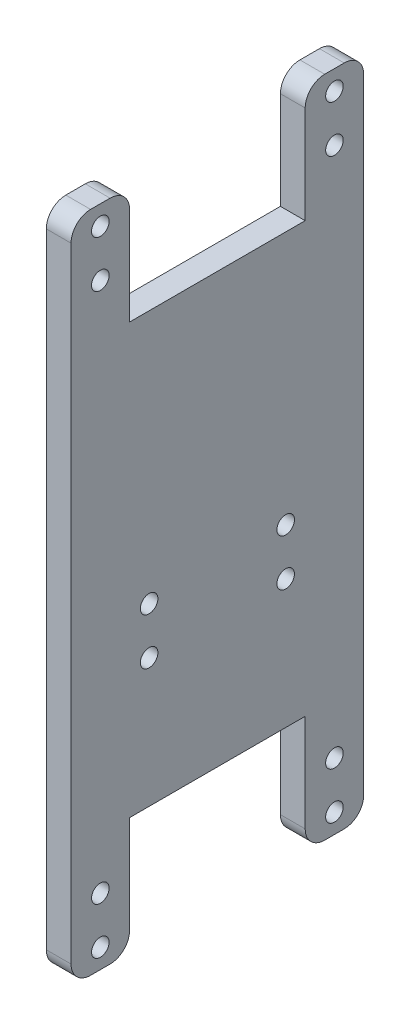
ISO-10303-21;
HEADER;
FILE_DESCRIPTION(('STEP AP214'),'2;1');
FILE_NAME('part.step','',(''),(''),'','','');
FILE_SCHEMA(('AUTOMOTIVE_DESIGN { 1 0 10303 214 1 1 1 1 }'));
ENDSEC;
DATA;
#1=APPLICATION_CONTEXT('core data for automotive mechanical design processes');
#2=APPLICATION_PROTOCOL_DEFINITION('international standard','automotive_design',2000,#1);
#3=PRODUCT_CONTEXT('',#1,'mechanical');
#4=PRODUCT('Part','Part','',(#3));
#5=PRODUCT_RELATED_PRODUCT_CATEGORY('part','',(#4));
#6=PRODUCT_DEFINITION_FORMATION('','',#4);
#7=PRODUCT_DEFINITION_CONTEXT('part definition',#1,'design');
#8=PRODUCT_DEFINITION('design','',#6,#7);
#9=PRODUCT_DEFINITION_SHAPE('','',#8);
#10=(LENGTH_UNIT() NAMED_UNIT(*) SI_UNIT(.MILLI.,.METRE.));
#11=(NAMED_UNIT(*) PLANE_ANGLE_UNIT() SI_UNIT($,.RADIAN.));
#12=(NAMED_UNIT(*) SI_UNIT($,.STERADIAN.) SOLID_ANGLE_UNIT());
#13=UNCERTAINTY_MEASURE_WITH_UNIT(LENGTH_MEASURE(1.E-05),#10,'distance_accuracy_value','');
#14=(GEOMETRIC_REPRESENTATION_CONTEXT(3) GLOBAL_UNCERTAINTY_ASSIGNED_CONTEXT((#13)) GLOBAL_UNIT_ASSIGNED_CONTEXT((#10,
#11,#12)) REPRESENTATION_CONTEXT('',''));
#15=CARTESIAN_POINT('',(0.,0.,0.));
#16=DIRECTION('',(0.,0.,1.));
#17=DIRECTION('',(1.,0.,0.));
#18=AXIS2_PLACEMENT_3D('',#15,#16,#17);
#19=CARTESIAN_POINT('',(6.35,0.,0.));
#20=DIRECTION('',(-1.,0.,0.));
#21=DIRECTION('',(0.,0.,1.));
#22=AXIS2_PLACEMENT_3D('',#19,#20,#21);
#23=PLANE('',#22);
#24=CARTESIAN_POINT('',(6.35,67.9999999999999,29.9999999999998));
#25=DIRECTION('',(-1.,0.,0.));
#26=DIRECTION('',(0.,0.,1.));
#27=AXIS2_PLACEMENT_3D('',#24,#25,#26);
#28=CIRCLE('',#27,2.25);
#29=CARTESIAN_POINT('',(6.35,67.9999999999999,32.2499999999998));
#30=VERTEX_POINT('',#29);
#31=EDGE_CURVE('E386',#30,#30,#28,.T.);
#32=ORIENTED_EDGE('',*,*,#31,.T.);
#33=EDGE_LOOP('',(#32));
#34=FACE_BOUND('',#33,.T.);
#35=CARTESIAN_POINT('',(6.35,80.,29.9999999999998));
#36=DIRECTION('',(-1.,0.,0.));
#37=DIRECTION('',(0.,0.,1.));
#38=AXIS2_PLACEMENT_3D('',#35,#36,#37);
#39=CIRCLE('',#38,2.25);
#40=CARTESIAN_POINT('',(6.35,80.,32.2499999999998));
#41=VERTEX_POINT('',#40);
#42=EDGE_CURVE('E380',#41,#41,#39,.T.);
#43=ORIENTED_EDGE('',*,*,#42,.T.);
#44=EDGE_LOOP('',(#43));
#45=FACE_BOUND('',#44,.T.);
#46=CARTESIAN_POINT('',(6.35,67.9999999999999,-29.9999999999998));
#47=DIRECTION('',(-1.,0.,0.));
#48=DIRECTION('',(0.,0.,1.));
#49=AXIS2_PLACEMENT_3D('',#46,#47,#48);
#50=CIRCLE('',#49,2.25);
#51=CARTESIAN_POINT('',(6.35,67.9999999999999,-27.7499999999998));
#52=VERTEX_POINT('',#51);
#53=EDGE_CURVE('E374',#52,#52,#50,.T.);
#54=ORIENTED_EDGE('',*,*,#53,.T.);
#55=EDGE_LOOP('',(#54));
#56=FACE_BOUND('',#55,.T.);
#57=CARTESIAN_POINT('',(6.35,80.,-29.9999999999998));
#58=DIRECTION('',(-1.,0.,0.));
#59=DIRECTION('',(0.,0.,1.));
#60=AXIS2_PLACEMENT_3D('',#57,#58,#59);
#61=CIRCLE('',#60,2.25);
#62=CARTESIAN_POINT('',(6.35,80.,-27.7499999999998));
#63=VERTEX_POINT('',#62);
#64=EDGE_CURVE('E368',#63,#63,#61,.T.);
#65=ORIENTED_EDGE('',*,*,#64,.T.);
#66=EDGE_LOOP('',(#65));
#67=FACE_BOUND('',#66,.T.);
#68=CARTESIAN_POINT('',(6.35,-80.,29.9999999999997));
#69=DIRECTION('',(-1.,0.,0.));
#70=DIRECTION('',(0.,0.,1.));
#71=AXIS2_PLACEMENT_3D('',#68,#69,#70);
#72=CIRCLE('',#71,2.25);
#73=CARTESIAN_POINT('',(6.35,-80.,32.2499999999997));
#74=VERTEX_POINT('',#73);
#75=EDGE_CURVE('E362',#74,#74,#72,.T.);
#76=ORIENTED_EDGE('',*,*,#75,.T.);
#77=EDGE_LOOP('',(#76));
#78=FACE_BOUND('',#77,.T.);
#79=CARTESIAN_POINT('',(6.35,-67.9999999999999,29.9999999999997));
#80=DIRECTION('',(-1.,0.,0.));
#81=DIRECTION('',(0.,0.,1.));
#82=AXIS2_PLACEMENT_3D('',#79,#80,#81);
#83=CIRCLE('',#82,2.25);
#84=CARTESIAN_POINT('',(6.35,-67.9999999999999,32.2499999999997));
#85=VERTEX_POINT('',#84);
#86=EDGE_CURVE('E356',#85,#85,#83,.T.);
#87=ORIENTED_EDGE('',*,*,#86,.T.);
#88=EDGE_LOOP('',(#87));
#89=FACE_BOUND('',#88,.T.);
#90=CARTESIAN_POINT('',(6.35,-80.,-29.9999999999997));
#91=DIRECTION('',(-1.,0.,0.));
#92=DIRECTION('',(0.,0.,1.));
#93=AXIS2_PLACEMENT_3D('',#90,#91,#92);
#94=CIRCLE('',#93,2.25);
#95=CARTESIAN_POINT('',(6.35,-80.,-27.7499999999997));
#96=VERTEX_POINT('',#95);
#97=EDGE_CURVE('E350',#96,#96,#94,.T.);
#98=ORIENTED_EDGE('',*,*,#97,.T.);
#99=EDGE_LOOP('',(#98));
#100=FACE_BOUND('',#99,.T.);
#101=CARTESIAN_POINT('',(6.35,-68.,-29.9999999999997));
#102=DIRECTION('',(-1.,0.,0.));
#103=DIRECTION('',(0.,0.,1.));
#104=AXIS2_PLACEMENT_3D('',#101,#102,#103);
#105=CIRCLE('',#104,2.25);
#106=CARTESIAN_POINT('',(6.35,-68.,-27.7499999999997));
#107=VERTEX_POINT('',#106);
#108=EDGE_CURVE('E222',#107,#107,#105,.T.);
#109=ORIENTED_EDGE('',*,*,#108,.T.);
#110=EDGE_LOOP('',(#109));
#111=FACE_BOUND('',#110,.T.);
#112=DIRECTION('',(0.,-1.,0.));
#113=VECTOR('',#112,1.);
#114=CARTESIAN_POINT('',(6.35,-55.,-22.5));
#115=LINE('',#114,#113);
#116=CARTESIAN_POINT('',(6.35,-55.,-22.5));
#117=VERTEX_POINT('',#116);
#118=CARTESIAN_POINT('',(6.35,-80.,-22.5));
#119=VERTEX_POINT('',#118);
#120=EDGE_CURVE('E198',#117,#119,#115,.T.);
#121=ORIENTED_EDGE('',*,*,#120,.T.);
#122=CARTESIAN_POINT('',(6.35,-80.,-27.5));
#123=DIRECTION('',(-1.,0.,0.));
#124=DIRECTION('',(0.,0.,1.));
#125=AXIS2_PLACEMENT_3D('',#122,#123,#124);
#126=CIRCLE('',#125,5.);
#127=CARTESIAN_POINT('',(6.35,-85.,-27.5));
#128=VERTEX_POINT('',#127);
#129=EDGE_CURVE('E290',#119,#128,#126,.F.);
#130=ORIENTED_EDGE('',*,*,#129,.T.);
#131=DIRECTION('',(0.,0.,-1.));
#132=VECTOR('',#131,1.);
#133=CARTESIAN_POINT('',(6.35,-85.,-22.5));
#134=LINE('',#133,#132);
#135=CARTESIAN_POINT('',(6.35,-85.,-32.5));
#136=VERTEX_POINT('',#135);
#137=EDGE_CURVE('E200',#128,#136,#134,.T.);
#138=ORIENTED_EDGE('',*,*,#137,.T.);
#139=CARTESIAN_POINT('',(6.35,-80.,-32.5));
#140=DIRECTION('',(-1.,0.,0.));
#141=DIRECTION('',(0.,0.,1.));
#142=AXIS2_PLACEMENT_3D('',#139,#140,#141);
#143=CIRCLE('',#142,5.);
#144=CARTESIAN_POINT('',(6.35,-80.,-37.5));
#145=VERTEX_POINT('',#144);
#146=EDGE_CURVE('E284',#136,#145,#143,.F.);
#147=ORIENTED_EDGE('',*,*,#146,.T.);
#148=DIRECTION('',(0.,1.,0.));
#149=VECTOR('',#148,1.);
#150=CARTESIAN_POINT('',(6.35,-35.,-37.5));
#151=LINE('',#150,#149);
#152=CARTESIAN_POINT('',(6.35,80.,-37.5));
#153=VERTEX_POINT('',#152);
#154=EDGE_CURVE('E206',#145,#153,#151,.T.);
#155=ORIENTED_EDGE('',*,*,#154,.T.);
#156=CARTESIAN_POINT('',(6.35,80.,-32.5));
#157=DIRECTION('',(-1.,0.,0.));
#158=DIRECTION('',(0.,0.,1.));
#159=AXIS2_PLACEMENT_3D('',#156,#157,#158);
#160=CIRCLE('',#159,5.);
#161=CARTESIAN_POINT('',(6.35,85.,-32.5));
#162=VERTEX_POINT('',#161);
#163=EDGE_CURVE('E280',#153,#162,#160,.F.);
#164=ORIENTED_EDGE('',*,*,#163,.T.);
#165=DIRECTION('',(0.,0.,1.));
#166=VECTOR('',#165,1.);
#167=CARTESIAN_POINT('',(6.35,85.,-22.5));
#168=LINE('',#167,#166);
#169=CARTESIAN_POINT('',(6.35,85.,-27.5));
#170=VERTEX_POINT('',#169);
#171=EDGE_CURVE('E209',#162,#170,#168,.T.);
#172=ORIENTED_EDGE('',*,*,#171,.T.);
#173=CARTESIAN_POINT('',(6.35,80.,-27.5));
#174=DIRECTION('',(-1.,0.,0.));
#175=DIRECTION('',(0.,0.,1.));
#176=AXIS2_PLACEMENT_3D('',#173,#174,#175);
#177=CIRCLE('',#176,5.);
#178=CARTESIAN_POINT('',(6.35,80.,-22.5));
#179=VERTEX_POINT('',#178);
#180=EDGE_CURVE('E56',#170,#179,#177,.F.);
#181=ORIENTED_EDGE('',*,*,#180,.T.);
#182=DIRECTION('',(0.,-1.,0.));
#183=VECTOR('',#182,1.);
#184=CARTESIAN_POINT('',(6.35,55.,-22.5));
#185=LINE('',#184,#183);
#186=CARTESIAN_POINT('',(6.35,55.,-22.5));
#187=VERTEX_POINT('',#186);
#188=EDGE_CURVE('E211',#179,#187,#185,.T.);
#189=ORIENTED_EDGE('',*,*,#188,.T.);
#190=DIRECTION('',(0.,0.,1.));
#191=VECTOR('',#190,1.);
#192=CARTESIAN_POINT('',(6.35,55.,22.5));
#193=LINE('',#192,#191);
#194=CARTESIAN_POINT('',(6.35,55.,22.5));
#195=VERTEX_POINT('',#194);
#196=EDGE_CURVE('E213',#187,#195,#193,.T.);
#197=ORIENTED_EDGE('',*,*,#196,.T.);
#198=DIRECTION('',(0.,1.,0.));
#199=VECTOR('',#198,1.);
#200=CARTESIAN_POINT('',(6.35,85.,22.5));
#201=LINE('',#200,#199);
#202=CARTESIAN_POINT('',(6.35,80.,22.5));
#203=VERTEX_POINT('',#202);
#204=EDGE_CURVE('E215',#195,#203,#201,.T.);
#205=ORIENTED_EDGE('',*,*,#204,.T.);
#206=CARTESIAN_POINT('',(6.35,80.,27.5));
#207=DIRECTION('',(-1.,0.,0.));
#208=DIRECTION('',(0.,0.,1.));
#209=AXIS2_PLACEMENT_3D('',#206,#207,#208);
#210=CIRCLE('',#209,5.);
#211=CARTESIAN_POINT('',(6.35,85.,27.5));
#212=VERTEX_POINT('',#211);
#213=EDGE_CURVE('E286',#203,#212,#210,.F.);
#214=ORIENTED_EDGE('',*,*,#213,.T.);
#215=DIRECTION('',(0.,0.,1.));
#216=VECTOR('',#215,1.);
#217=CARTESIAN_POINT('',(6.35,85.,37.5));
#218=LINE('',#217,#216);
#219=CARTESIAN_POINT('',(6.35,85.,32.5));
#220=VERTEX_POINT('',#219);
#221=EDGE_CURVE('E249',#212,#220,#218,.T.);
#222=ORIENTED_EDGE('',*,*,#221,.T.);
#223=CARTESIAN_POINT('',(6.35,80.,32.5));
#224=DIRECTION('',(-1.,0.,0.));
#225=DIRECTION('',(0.,0.,1.));
#226=AXIS2_PLACEMENT_3D('',#223,#224,#225);
#227=CIRCLE('',#226,5.);
#228=CARTESIAN_POINT('',(6.35,80.,37.5));
#229=VERTEX_POINT('',#228);
#230=EDGE_CURVE('E278',#220,#229,#227,.F.);
#231=ORIENTED_EDGE('',*,*,#230,.T.);
#232=DIRECTION('',(0.,-1.,0.));
#233=VECTOR('',#232,1.);
#234=CARTESIAN_POINT('',(6.35,85.,37.5));
#235=LINE('',#234,#233);
#236=CARTESIAN_POINT('',(6.35,-80.,37.5));
#237=VERTEX_POINT('',#236);
#238=EDGE_CURVE('E325',#229,#237,#235,.T.);
#239=ORIENTED_EDGE('',*,*,#238,.T.);
#240=CARTESIAN_POINT('',(6.35,-80.,32.5));
#241=DIRECTION('',(-1.,0.,0.));
#242=DIRECTION('',(0.,0.,1.));
#243=AXIS2_PLACEMENT_3D('',#240,#241,#242);
#244=CIRCLE('',#243,5.);
#245=CARTESIAN_POINT('',(6.35,-85.,32.5));
#246=VERTEX_POINT('',#245);
#247=EDGE_CURVE('E282',#237,#246,#244,.F.);
#248=ORIENTED_EDGE('',*,*,#247,.T.);
#249=DIRECTION('',(0.,0.,-1.));
#250=VECTOR('',#249,1.);
#251=CARTESIAN_POINT('',(6.35,-85.,37.5));
#252=LINE('',#251,#250);
#253=CARTESIAN_POINT('',(6.35,-85.,27.5));
#254=VERTEX_POINT('',#253);
#255=EDGE_CURVE('E183',#246,#254,#252,.T.);
#256=ORIENTED_EDGE('',*,*,#255,.T.);
#257=CARTESIAN_POINT('',(6.35,-80.,27.5));
#258=DIRECTION('',(-1.,0.,0.));
#259=DIRECTION('',(0.,0.,1.));
#260=AXIS2_PLACEMENT_3D('',#257,#258,#259);
#261=CIRCLE('',#260,5.);
#262=CARTESIAN_POINT('',(6.35,-80.,22.5));
#263=VERTEX_POINT('',#262);
#264=EDGE_CURVE('E179',#254,#263,#261,.F.);
#265=ORIENTED_EDGE('',*,*,#264,.T.);
#266=DIRECTION('',(0.,1.,0.));
#267=VECTOR('',#266,1.);
#268=CARTESIAN_POINT('',(6.35,-85.,22.5));
#269=LINE('',#268,#267);
#270=CARTESIAN_POINT('',(6.35,-55.,22.5));
#271=VERTEX_POINT('',#270);
#272=EDGE_CURVE('E170',#263,#271,#269,.T.);
#273=ORIENTED_EDGE('',*,*,#272,.T.);
#274=DIRECTION('',(0.,0.,-1.));
#275=VECTOR('',#274,1.);
#276=CARTESIAN_POINT('',(6.35,-55.,22.5));
#277=LINE('',#276,#275);
#278=EDGE_CURVE('E175',#271,#117,#277,.T.);
#279=ORIENTED_EDGE('',*,*,#278,.T.);
#280=EDGE_LOOP('',(#121,#130,#138,#147,#155,#164,#172,#181,#189,#197,#205,#214,#222,#231,#239,
#248,#256,#265,#273,#279));
#281=FACE_BOUND('',#280,.T.);
#282=CARTESIAN_POINT('',(6.35,-22.,17.5));
#283=DIRECTION('',(1.,0.,0.));
#284=DIRECTION('',(0.,0.,-1.));
#285=AXIS2_PLACEMENT_3D('',#282,#283,#284);
#286=CIRCLE('',#285,2.24999999999999);
#287=CARTESIAN_POINT('',(6.35,-22.,15.25));
#288=VERTEX_POINT('',#287);
#289=EDGE_CURVE('E395',#288,#288,#286,.T.);
#290=ORIENTED_EDGE('',*,*,#289,.F.);
#291=EDGE_LOOP('',(#290));
#292=FACE_BOUND('',#291,.T.);
#293=CARTESIAN_POINT('',(6.35,-22.,-17.5));
#294=DIRECTION('',(1.,0.,0.));
#295=DIRECTION('',(0.,0.,-1.));
#296=AXIS2_PLACEMENT_3D('',#293,#294,#295);
#297=CIRCLE('',#296,2.24999999999999);
#298=CARTESIAN_POINT('',(6.35,-22.,-19.75));
#299=VERTEX_POINT('',#298);
#300=EDGE_CURVE('E401',#299,#299,#297,.T.);
#301=ORIENTED_EDGE('',*,*,#300,.F.);
#302=EDGE_LOOP('',(#301));
#303=FACE_BOUND('',#302,.T.);
#304=CARTESIAN_POINT('',(6.35,-10.,-17.5));
#305=DIRECTION('',(1.,0.,0.));
#306=DIRECTION('',(0.,0.,-1.));
#307=AXIS2_PLACEMENT_3D('',#304,#305,#306);
#308=CIRCLE('',#307,2.24999999999999);
#309=CARTESIAN_POINT('',(6.35,-10.,-19.75));
#310=VERTEX_POINT('',#309);
#311=EDGE_CURVE('E407',#310,#310,#308,.T.);
#312=ORIENTED_EDGE('',*,*,#311,.F.);
#313=EDGE_LOOP('',(#312));
#314=FACE_BOUND('',#313,.T.);
#315=CARTESIAN_POINT('',(6.35,-10.,17.5));
#316=DIRECTION('',(1.,0.,0.));
#317=DIRECTION('',(0.,0.,-1.));
#318=AXIS2_PLACEMENT_3D('',#315,#316,#317);
#319=CIRCLE('',#318,2.24999999999999);
#320=CARTESIAN_POINT('',(6.35,-10.,15.25));
#321=VERTEX_POINT('',#320);
#322=EDGE_CURVE('E413',#321,#321,#319,.T.);
#323=ORIENTED_EDGE('',*,*,#322,.F.);
#324=EDGE_LOOP('',(#323));
#325=FACE_BOUND('',#324,.T.);
#326=ADVANCED_FACE('F33',(#34,#45,#56,#67,#78,#89,#100,#111,#281,#292,#303,#314,#325),#23,.F.);
#327=CARTESIAN_POINT('',(6.35,85.,37.5));
#328=DIRECTION('',(0.,-1.,0.));
#329=DIRECTION('',(0.,0.,-1.));
#330=AXIS2_PLACEMENT_3D('',#327,#328,#329);
#331=PLANE('',#330);
#332=ORIENTED_EDGE('',*,*,#221,.F.);
#333=DIRECTION('',(-1.,0.,0.));
#334=VECTOR('',#333,1.);
#335=CARTESIAN_POINT('',(6.35,85.,27.5));
#336=LINE('',#335,#334);
#337=CARTESIAN_POINT('',(0.,85.,27.5));
#338=VERTEX_POINT('',#337);
#339=EDGE_CURVE('E309',#212,#338,#336,.T.);
#340=ORIENTED_EDGE('',*,*,#339,.T.);
#341=DIRECTION('',(0.,0.,1.));
#342=VECTOR('',#341,1.);
#343=CARTESIAN_POINT('',(0.,85.,37.5));
#344=LINE('',#343,#342);
#345=CARTESIAN_POINT('',(0.,85.,32.5));
#346=VERTEX_POINT('',#345);
#347=EDGE_CURVE('E218',#338,#346,#344,.T.);
#348=ORIENTED_EDGE('',*,*,#347,.T.);
#349=DIRECTION('',(-1.,0.,0.));
#350=VECTOR('',#349,1.);
#351=CARTESIAN_POINT('',(6.35,85.,32.5));
#352=LINE('',#351,#350);
#353=EDGE_CURVE('E307',#346,#220,#352,.F.);
#354=ORIENTED_EDGE('',*,*,#353,.T.);
#355=EDGE_LOOP('',(#332,#340,#348,#354));
#356=FACE_BOUND('',#355,.T.);
#357=ADVANCED_FACE('F421',(#356),#331,.F.);
#358=CARTESIAN_POINT('',(6.35,-35.,37.5));
#359=DIRECTION('',(0.,0.,-1.));
#360=DIRECTION('',(-1.,0.,0.));
#361=AXIS2_PLACEMENT_3D('',#358,#359,#360);
#362=PLANE('',#361);
#363=DIRECTION('',(0.,-1.,0.));
#364=VECTOR('',#363,1.);
#365=CARTESIAN_POINT('',(0.,-35.,37.5));
#366=LINE('',#365,#364);
#367=CARTESIAN_POINT('',(0.,80.,37.5));
#368=VERTEX_POINT('',#367);
#369=CARTESIAN_POINT('',(0.,-80.,37.5));
#370=VERTEX_POINT('',#369);
#371=EDGE_CURVE('E221',#368,#370,#366,.T.);
#372=ORIENTED_EDGE('',*,*,#371,.T.);
#373=DIRECTION('',(-1.,0.,0.));
#374=VECTOR('',#373,1.);
#375=CARTESIAN_POINT('',(6.35,-80.,37.5));
#376=LINE('',#375,#374);
#377=EDGE_CURVE('E11',#370,#237,#376,.F.);
#378=ORIENTED_EDGE('',*,*,#377,.T.);
#379=ORIENTED_EDGE('',*,*,#238,.F.);
#380=DIRECTION('',(-1.,0.,0.));
#381=VECTOR('',#380,1.);
#382=CARTESIAN_POINT('',(6.35,80.,37.5));
#383=LINE('',#382,#381);
#384=EDGE_CURVE('E41',#229,#368,#383,.T.);
#385=ORIENTED_EDGE('',*,*,#384,.T.);
#386=EDGE_LOOP('',(#372,#378,#379,#385));
#387=FACE_BOUND('',#386,.T.);
#388=ADVANCED_FACE('F322',(#387),#362,.F.);
#389=CARTESIAN_POINT('',(6.35,-85.,37.5));
#390=DIRECTION('',(0.,1.,0.));
#391=DIRECTION('',(0.,0.,1.));
#392=AXIS2_PLACEMENT_3D('',#389,#390,#391);
#393=PLANE('',#392);
#394=DIRECTION('',(0.,0.,-1.));
#395=VECTOR('',#394,1.);
#396=CARTESIAN_POINT('',(0.,-85.,37.5));
#397=LINE('',#396,#395);
#398=CARTESIAN_POINT('',(0.,-85.,32.5));
#399=VERTEX_POINT('',#398);
#400=CARTESIAN_POINT('',(0.,-85.,27.5));
#401=VERTEX_POINT('',#400);
#402=EDGE_CURVE('E225',#399,#401,#397,.T.);
#403=ORIENTED_EDGE('',*,*,#402,.T.);
#404=DIRECTION('',(-1.,0.,0.));
#405=VECTOR('',#404,1.);
#406=CARTESIAN_POINT('',(6.35,-85.,27.5));
#407=LINE('',#406,#405);
#408=EDGE_CURVE('E297',#401,#254,#407,.F.);
#409=ORIENTED_EDGE('',*,*,#408,.T.);
#410=ORIENTED_EDGE('',*,*,#255,.F.);
#411=DIRECTION('',(-1.,0.,0.));
#412=VECTOR('',#411,1.);
#413=CARTESIAN_POINT('',(6.35,-85.,32.5));
#414=LINE('',#413,#412);
#415=EDGE_CURVE('E294',#246,#399,#414,.T.);
#416=ORIENTED_EDGE('',*,*,#415,.T.);
#417=EDGE_LOOP('',(#403,#409,#410,#416));
#418=FACE_BOUND('',#417,.T.);
#419=ADVANCED_FACE('F339',(#418),#393,.F.);
#420=CARTESIAN_POINT('',(6.35,-85.,22.5));
#421=DIRECTION('',(0.,0.,1.));
#422=DIRECTION('',(0.,-1.,0.));
#423=AXIS2_PLACEMENT_3D('',#420,#421,#422);
#424=PLANE('',#423);
#425=ORIENTED_EDGE('',*,*,#272,.F.);
#426=DIRECTION('',(-1.,0.,0.));
#427=VECTOR('',#426,1.);
#428=CARTESIAN_POINT('',(6.35,-80.,22.5));
#429=LINE('',#428,#427);
#430=CARTESIAN_POINT('',(0.,-80.,22.5));
#431=VERTEX_POINT('',#430);
#432=EDGE_CURVE('E292',#263,#431,#429,.T.);
#433=ORIENTED_EDGE('',*,*,#432,.T.);
#434=DIRECTION('',(0.,1.,0.));
#435=VECTOR('',#434,1.);
#436=CARTESIAN_POINT('',(0.,-85.,22.5));
#437=LINE('',#436,#435);
#438=CARTESIAN_POINT('',(0.,-55.,22.5));
#439=VERTEX_POINT('',#438);
#440=EDGE_CURVE('E189',#431,#439,#437,.T.);
#441=ORIENTED_EDGE('',*,*,#440,.T.);
#442=DIRECTION('',(-1.,0.,0.));
#443=VECTOR('',#442,1.);
#444=CARTESIAN_POINT('',(6.35,-55.,22.5));
#445=LINE('',#444,#443);
#446=EDGE_CURVE('E186',#271,#439,#445,.T.);
#447=ORIENTED_EDGE('',*,*,#446,.F.);
#448=EDGE_LOOP('',(#425,#433,#441,#447));
#449=FACE_BOUND('',#448,.T.);
#450=ADVANCED_FACE('F187',(#449),#424,.F.);
#451=CARTESIAN_POINT('',(6.35,-55.,22.5));
#452=DIRECTION('',(0.,1.,0.));
#453=DIRECTION('',(0.,0.,1.));
#454=AXIS2_PLACEMENT_3D('',#451,#452,#453);
#455=PLANE('',#454);
#456=DIRECTION('',(0.,0.,-1.));
#457=VECTOR('',#456,1.);
#458=CARTESIAN_POINT('',(0.,-55.,22.5));
#459=LINE('',#458,#457);
#460=CARTESIAN_POINT('',(0.,-55.,-22.5));
#461=VERTEX_POINT('',#460);
#462=EDGE_CURVE('E229',#439,#461,#459,.T.);
#463=ORIENTED_EDGE('',*,*,#462,.T.);
#464=DIRECTION('',(-1.,0.,0.));
#465=VECTOR('',#464,1.);
#466=CARTESIAN_POINT('',(6.35,-55.,-22.5));
#467=LINE('',#466,#465);
#468=EDGE_CURVE('E193',#117,#461,#467,.T.);
#469=ORIENTED_EDGE('',*,*,#468,.F.);
#470=ORIENTED_EDGE('',*,*,#278,.F.);
#471=ORIENTED_EDGE('',*,*,#446,.T.);
#472=EDGE_LOOP('',(#463,#469,#470,#471));
#473=FACE_BOUND('',#472,.T.);
#474=ADVANCED_FACE('F195',(#473),#455,.F.);
#475=CARTESIAN_POINT('',(6.35,-55.,-22.5));
#476=DIRECTION('',(0.,0.,-1.));
#477=DIRECTION('',(0.,1.,0.));
#478=AXIS2_PLACEMENT_3D('',#475,#476,#477);
#479=PLANE('',#478);
#480=DIRECTION('',(0.,-1.,0.));
#481=VECTOR('',#480,1.);
#482=CARTESIAN_POINT('',(0.,-55.,-22.5));
#483=LINE('',#482,#481);
#484=CARTESIAN_POINT('',(0.,-80.,-22.5));
#485=VERTEX_POINT('',#484);
#486=EDGE_CURVE('E231',#461,#485,#483,.T.);
#487=ORIENTED_EDGE('',*,*,#486,.T.);
#488=DIRECTION('',(-1.,0.,0.));
#489=VECTOR('',#488,1.);
#490=CARTESIAN_POINT('',(6.35,-80.,-22.5));
#491=LINE('',#490,#489);
#492=EDGE_CURVE('E276',#485,#119,#491,.F.);
#493=ORIENTED_EDGE('',*,*,#492,.T.);
#494=ORIENTED_EDGE('',*,*,#120,.F.);
#495=ORIENTED_EDGE('',*,*,#468,.T.);
#496=EDGE_LOOP('',(#487,#493,#494,#495));
#497=FACE_BOUND('',#496,.T.);
#498=ADVANCED_FACE('F459',(#497),#479,.F.);
#499=CARTESIAN_POINT('',(6.35,-85.,-22.5));
#500=DIRECTION('',(0.,1.,0.));
#501=DIRECTION('',(0.,0.,1.));
#502=AXIS2_PLACEMENT_3D('',#499,#500,#501);
#503=PLANE('',#502);
#504=ORIENTED_EDGE('',*,*,#137,.F.);
#505=DIRECTION('',(-1.,0.,0.));
#506=VECTOR('',#505,1.);
#507=CARTESIAN_POINT('',(6.35,-85.,-27.5));
#508=LINE('',#507,#506);
#509=CARTESIAN_POINT('',(0.,-85.,-27.5));
#510=VERTEX_POINT('',#509);
#511=EDGE_CURVE('E257',#128,#510,#508,.T.);
#512=ORIENTED_EDGE('',*,*,#511,.T.);
#513=DIRECTION('',(0.,0.,-1.));
#514=VECTOR('',#513,1.);
#515=CARTESIAN_POINT('',(0.,-85.,-22.5));
#516=LINE('',#515,#514);
#517=CARTESIAN_POINT('',(0.,-85.,-32.5));
#518=VERTEX_POINT('',#517);
#519=EDGE_CURVE('E234',#510,#518,#516,.T.);
#520=ORIENTED_EDGE('',*,*,#519,.T.);
#521=DIRECTION('',(-1.,0.,0.));
#522=VECTOR('',#521,1.);
#523=CARTESIAN_POINT('',(6.35,-85.,-32.5));
#524=LINE('',#523,#522);
#525=EDGE_CURVE('E192',#518,#136,#524,.F.);
#526=ORIENTED_EDGE('',*,*,#525,.T.);
#527=EDGE_LOOP('',(#504,#512,#520,#526));
#528=FACE_BOUND('',#527,.T.);
#529=ADVANCED_FACE('F455',(#528),#503,.F.);
#530=CARTESIAN_POINT('',(6.35,85.,-37.5));
#531=DIRECTION('',(0.,0.,1.));
#532=DIRECTION('',(0.,-1.,0.));
#533=AXIS2_PLACEMENT_3D('',#530,#531,#532);
#534=PLANE('',#533);
#535=ORIENTED_EDGE('',*,*,#154,.F.);
#536=DIRECTION('',(-1.,0.,0.));
#537=VECTOR('',#536,1.);
#538=CARTESIAN_POINT('',(6.35,-80.,-37.5));
#539=LINE('',#538,#537);
#540=CARTESIAN_POINT('',(0.,-80.,-37.5));
#541=VERTEX_POINT('',#540);
#542=EDGE_CURVE('E315',#145,#541,#539,.T.);
#543=ORIENTED_EDGE('',*,*,#542,.T.);
#544=DIRECTION('',(0.,1.,0.));
#545=VECTOR('',#544,1.);
#546=CARTESIAN_POINT('',(0.,85.,-37.5));
#547=LINE('',#546,#545);
#548=CARTESIAN_POINT('',(0.,80.,-37.5));
#549=VERTEX_POINT('',#548);
#550=EDGE_CURVE('E237',#541,#549,#547,.T.);
#551=ORIENTED_EDGE('',*,*,#550,.T.);
#552=DIRECTION('',(-1.,0.,0.));
#553=VECTOR('',#552,1.);
#554=CARTESIAN_POINT('',(6.35,80.,-37.5));
#555=LINE('',#554,#553);
#556=EDGE_CURVE('E313',#549,#153,#555,.F.);
#557=ORIENTED_EDGE('',*,*,#556,.T.);
#558=EDGE_LOOP('',(#535,#543,#551,#557));
#559=FACE_BOUND('',#558,.T.);
#560=ADVANCED_FACE('F451',(#559),#534,.F.);
#561=CARTESIAN_POINT('',(6.35,85.,-22.5));
#562=DIRECTION('',(0.,-1.,0.));
#563=DIRECTION('',(0.,0.,-1.));
#564=AXIS2_PLACEMENT_3D('',#561,#562,#563);
#565=PLANE('',#564);
#566=DIRECTION('',(0.,0.,1.));
#567=VECTOR('',#566,1.);
#568=CARTESIAN_POINT('',(0.,85.,-22.5));
#569=LINE('',#568,#567);
#570=CARTESIAN_POINT('',(0.,85.,-32.5));
#571=VERTEX_POINT('',#570);
#572=CARTESIAN_POINT('',(0.,85.,-27.5));
#573=VERTEX_POINT('',#572);
#574=EDGE_CURVE('E240',#571,#573,#569,.T.);
#575=ORIENTED_EDGE('',*,*,#574,.T.);
#576=DIRECTION('',(-1.,0.,0.));
#577=VECTOR('',#576,1.);
#578=CARTESIAN_POINT('',(6.35,85.,-27.5));
#579=LINE('',#578,#577);
#580=EDGE_CURVE('E305',#573,#170,#579,.F.);
#581=ORIENTED_EDGE('',*,*,#580,.T.);
#582=ORIENTED_EDGE('',*,*,#171,.F.);
#583=DIRECTION('',(-1.,0.,0.));
#584=VECTOR('',#583,1.);
#585=CARTESIAN_POINT('',(6.35,85.,-32.5));
#586=LINE('',#585,#584);
#587=EDGE_CURVE('E302',#162,#571,#586,.T.);
#588=ORIENTED_EDGE('',*,*,#587,.T.);
#589=EDGE_LOOP('',(#575,#581,#582,#588));
#590=FACE_BOUND('',#589,.T.);
#591=ADVANCED_FACE('F447',(#590),#565,.F.);
#592=CARTESIAN_POINT('',(6.35,55.,-22.5));
#593=DIRECTION('',(0.,0.,-1.));
#594=DIRECTION('',(-1.,0.,0.));
#595=AXIS2_PLACEMENT_3D('',#592,#593,#594);
#596=PLANE('',#595);
#597=ORIENTED_EDGE('',*,*,#188,.F.);
#598=DIRECTION('',(-1.,0.,0.));
#599=VECTOR('',#598,1.);
#600=CARTESIAN_POINT('',(6.35,80.,-22.5));
#601=LINE('',#600,#599);
#602=CARTESIAN_POINT('',(0.,80.,-22.5));
#603=VERTEX_POINT('',#602);
#604=EDGE_CURVE('E299',#179,#603,#601,.T.);
#605=ORIENTED_EDGE('',*,*,#604,.T.);
#606=DIRECTION('',(0.,-1.,0.));
#607=VECTOR('',#606,1.);
#608=CARTESIAN_POINT('',(0.,55.,-22.5));
#609=LINE('',#608,#607);
#610=CARTESIAN_POINT('',(0.,55.,-22.5));
#611=VERTEX_POINT('',#610);
#612=EDGE_CURVE('E243',#603,#611,#609,.T.);
#613=ORIENTED_EDGE('',*,*,#612,.T.);
#614=DIRECTION('',(-1.,0.,0.));
#615=VECTOR('',#614,1.);
#616=CARTESIAN_POINT('',(6.35,55.,-22.5));
#617=LINE('',#616,#615);
#618=EDGE_CURVE('E252',#187,#611,#617,.T.);
#619=ORIENTED_EDGE('',*,*,#618,.F.);
#620=EDGE_LOOP('',(#597,#605,#613,#619));
#621=FACE_BOUND('',#620,.T.);
#622=ADVANCED_FACE('F443',(#621),#596,.F.);
#623=CARTESIAN_POINT('',(6.35,55.,22.5));
#624=DIRECTION('',(0.,-1.,0.));
#625=DIRECTION('',(0.,0.,-1.));
#626=AXIS2_PLACEMENT_3D('',#623,#624,#625);
#627=PLANE('',#626);
#628=DIRECTION('',(0.,0.,1.));
#629=VECTOR('',#628,1.);
#630=CARTESIAN_POINT('',(0.,55.,22.5));
#631=LINE('',#630,#629);
#632=CARTESIAN_POINT('',(0.,55.,22.5));
#633=VERTEX_POINT('',#632);
#634=EDGE_CURVE('E245',#611,#633,#631,.T.);
#635=ORIENTED_EDGE('',*,*,#634,.T.);
#636=DIRECTION('',(-1.,0.,0.));
#637=VECTOR('',#636,1.);
#638=CARTESIAN_POINT('',(6.35,55.,22.5));
#639=LINE('',#638,#637);
#640=EDGE_CURVE('E217',#195,#633,#639,.T.);
#641=ORIENTED_EDGE('',*,*,#640,.F.);
#642=ORIENTED_EDGE('',*,*,#196,.F.);
#643=ORIENTED_EDGE('',*,*,#618,.T.);
#644=EDGE_LOOP('',(#635,#641,#642,#643));
#645=FACE_BOUND('',#644,.T.);
#646=ADVANCED_FACE('F440',(#645),#627,.F.);
#647=CARTESIAN_POINT('',(6.35,85.,22.5));
#648=DIRECTION('',(0.,0.,1.));
#649=DIRECTION('',(0.,-1.,0.));
#650=AXIS2_PLACEMENT_3D('',#647,#648,#649);
#651=PLANE('',#650);
#652=DIRECTION('',(0.,1.,0.));
#653=VECTOR('',#652,1.);
#654=CARTESIAN_POINT('',(0.,85.,22.5));
#655=LINE('',#654,#653);
#656=CARTESIAN_POINT('',(0.,80.,22.5));
#657=VERTEX_POINT('',#656);
#658=EDGE_CURVE('E247',#633,#657,#655,.T.);
#659=ORIENTED_EDGE('',*,*,#658,.T.);
#660=DIRECTION('',(-1.,0.,0.));
#661=VECTOR('',#660,1.);
#662=CARTESIAN_POINT('',(6.35,80.,22.5));
#663=LINE('',#662,#661);
#664=EDGE_CURVE('E48',#657,#203,#663,.F.);
#665=ORIENTED_EDGE('',*,*,#664,.T.);
#666=ORIENTED_EDGE('',*,*,#204,.F.);
#667=ORIENTED_EDGE('',*,*,#640,.T.);
#668=EDGE_LOOP('',(#659,#665,#666,#667));
#669=FACE_BOUND('',#668,.T.);
#670=ADVANCED_FACE('F436',(#669),#651,.F.);
#671=CARTESIAN_POINT('',(0.,0.,0.));
#672=DIRECTION('',(-1.,0.,0.));
#673=DIRECTION('',(0.,0.,1.));
#674=AXIS2_PLACEMENT_3D('',#671,#672,#673);
#675=PLANE('',#674);
#676=CARTESIAN_POINT('',(0.,-10.,17.5));
#677=DIRECTION('',(-1.,0.,0.));
#678=DIRECTION('',(0.,0.,1.));
#679=AXIS2_PLACEMENT_3D('',#676,#677,#678);
#680=CIRCLE('',#679,2.24999999999999);
#681=CARTESIAN_POINT('',(0.,-10.,19.75));
#682=VERTEX_POINT('',#681);
#683=EDGE_CURVE('E410',#682,#682,#680,.T.);
#684=ORIENTED_EDGE('',*,*,#683,.F.);
#685=EDGE_LOOP('',(#684));
#686=FACE_BOUND('',#685,.T.);
#687=CARTESIAN_POINT('',(0.,-10.,-17.5));
#688=DIRECTION('',(-1.,0.,0.));
#689=DIRECTION('',(0.,0.,1.));
#690=AXIS2_PLACEMENT_3D('',#687,#688,#689);
#691=CIRCLE('',#690,2.24999999999999);
#692=CARTESIAN_POINT('',(0.,-10.,-15.25));
#693=VERTEX_POINT('',#692);
#694=EDGE_CURVE('E404',#693,#693,#691,.T.);
#695=ORIENTED_EDGE('',*,*,#694,.F.);
#696=EDGE_LOOP('',(#695));
#697=FACE_BOUND('',#696,.T.);
#698=CARTESIAN_POINT('',(0.,-22.,-17.5));
#699=DIRECTION('',(-1.,0.,0.));
#700=DIRECTION('',(0.,0.,1.));
#701=AXIS2_PLACEMENT_3D('',#698,#699,#700);
#702=CIRCLE('',#701,2.24999999999999);
#703=CARTESIAN_POINT('',(0.,-22.,-15.25));
#704=VERTEX_POINT('',#703);
#705=EDGE_CURVE('E398',#704,#704,#702,.T.);
#706=ORIENTED_EDGE('',*,*,#705,.F.);
#707=EDGE_LOOP('',(#706));
#708=FACE_BOUND('',#707,.T.);
#709=CARTESIAN_POINT('',(0.,-22.,17.5));
#710=DIRECTION('',(-1.,0.,0.));
#711=DIRECTION('',(0.,0.,1.));
#712=AXIS2_PLACEMENT_3D('',#709,#710,#711);
#713=CIRCLE('',#712,2.24999999999999);
#714=CARTESIAN_POINT('',(0.,-22.,19.75));
#715=VERTEX_POINT('',#714);
#716=EDGE_CURVE('E392',#715,#715,#713,.T.);
#717=ORIENTED_EDGE('',*,*,#716,.F.);
#718=EDGE_LOOP('',(#717));
#719=FACE_BOUND('',#718,.T.);
#720=CARTESIAN_POINT('',(0.,67.9999999999999,29.9999999999998));
#721=DIRECTION('',(-1.,0.,0.));
#722=DIRECTION('',(0.,0.,1.));
#723=AXIS2_PLACEMENT_3D('',#720,#721,#722);
#724=CIRCLE('',#723,2.25);
#725=CARTESIAN_POINT('',(0.,67.9999999999999,32.2499999999998));
#726=VERTEX_POINT('',#725);
#727=EDGE_CURVE('E389',#726,#726,#724,.T.);
#728=ORIENTED_EDGE('',*,*,#727,.F.);
#729=EDGE_LOOP('',(#728));
#730=FACE_BOUND('',#729,.T.);
#731=CARTESIAN_POINT('',(0.,80.,29.9999999999998));
#732=DIRECTION('',(-1.,0.,0.));
#733=DIRECTION('',(0.,0.,1.));
#734=AXIS2_PLACEMENT_3D('',#731,#732,#733);
#735=CIRCLE('',#734,2.25);
#736=CARTESIAN_POINT('',(0.,80.,32.2499999999998));
#737=VERTEX_POINT('',#736);
#738=EDGE_CURVE('E383',#737,#737,#735,.T.);
#739=ORIENTED_EDGE('',*,*,#738,.F.);
#740=EDGE_LOOP('',(#739));
#741=FACE_BOUND('',#740,.T.);
#742=CARTESIAN_POINT('',(0.,67.9999999999999,-29.9999999999998));
#743=DIRECTION('',(-1.,0.,0.));
#744=DIRECTION('',(0.,0.,1.));
#745=AXIS2_PLACEMENT_3D('',#742,#743,#744);
#746=CIRCLE('',#745,2.25);
#747=CARTESIAN_POINT('',(0.,67.9999999999999,-27.7499999999998));
#748=VERTEX_POINT('',#747);
#749=EDGE_CURVE('E377',#748,#748,#746,.T.);
#750=ORIENTED_EDGE('',*,*,#749,.F.);
#751=EDGE_LOOP('',(#750));
#752=FACE_BOUND('',#751,.T.);
#753=CARTESIAN_POINT('',(0.,80.,-29.9999999999998));
#754=DIRECTION('',(-1.,0.,0.));
#755=DIRECTION('',(0.,0.,1.));
#756=AXIS2_PLACEMENT_3D('',#753,#754,#755);
#757=CIRCLE('',#756,2.25);
#758=CARTESIAN_POINT('',(0.,80.,-27.7499999999998));
#759=VERTEX_POINT('',#758);
#760=EDGE_CURVE('E371',#759,#759,#757,.T.);
#761=ORIENTED_EDGE('',*,*,#760,.F.);
#762=EDGE_LOOP('',(#761));
#763=FACE_BOUND('',#762,.T.);
#764=CARTESIAN_POINT('',(0.,-80.,29.9999999999997));
#765=DIRECTION('',(-1.,0.,0.));
#766=DIRECTION('',(0.,0.,1.));
#767=AXIS2_PLACEMENT_3D('',#764,#765,#766);
#768=CIRCLE('',#767,2.25);
#769=CARTESIAN_POINT('',(0.,-80.,32.2499999999997));
#770=VERTEX_POINT('',#769);
#771=EDGE_CURVE('E365',#770,#770,#768,.T.);
#772=ORIENTED_EDGE('',*,*,#771,.F.);
#773=EDGE_LOOP('',(#772));
#774=FACE_BOUND('',#773,.T.);
#775=CARTESIAN_POINT('',(0.,-67.9999999999999,29.9999999999997));
#776=DIRECTION('',(-1.,0.,0.));
#777=DIRECTION('',(0.,0.,1.));
#778=AXIS2_PLACEMENT_3D('',#775,#776,#777);
#779=CIRCLE('',#778,2.25);
#780=CARTESIAN_POINT('',(0.,-67.9999999999999,32.2499999999997));
#781=VERTEX_POINT('',#780);
#782=EDGE_CURVE('E359',#781,#781,#779,.T.);
#783=ORIENTED_EDGE('',*,*,#782,.F.);
#784=EDGE_LOOP('',(#783));
#785=FACE_BOUND('',#784,.T.);
#786=CARTESIAN_POINT('',(0.,-80.,-29.9999999999997));
#787=DIRECTION('',(-1.,0.,0.));
#788=DIRECTION('',(0.,0.,1.));
#789=AXIS2_PLACEMENT_3D('',#786,#787,#788);
#790=CIRCLE('',#789,2.25);
#791=CARTESIAN_POINT('',(0.,-80.,-27.7499999999997));
#792=VERTEX_POINT('',#791);
#793=EDGE_CURVE('E353',#792,#792,#790,.T.);
#794=ORIENTED_EDGE('',*,*,#793,.F.);
#795=EDGE_LOOP('',(#794));
#796=FACE_BOUND('',#795,.T.);
#797=CARTESIAN_POINT('',(0.,-68.,-29.9999999999997));
#798=DIRECTION('',(-1.,0.,0.));
#799=DIRECTION('',(0.,0.,1.));
#800=AXIS2_PLACEMENT_3D('',#797,#798,#799);
#801=CIRCLE('',#800,2.25);
#802=CARTESIAN_POINT('',(0.,-68.,-27.7499999999997));
#803=VERTEX_POINT('',#802);
#804=EDGE_CURVE('E347',#803,#803,#801,.T.);
#805=ORIENTED_EDGE('',*,*,#804,.F.);
#806=EDGE_LOOP('',(#805));
#807=FACE_BOUND('',#806,.T.);
#808=ORIENTED_EDGE('',*,*,#519,.F.);
#809=CARTESIAN_POINT('',(0.,-80.,-27.5));
#810=DIRECTION('',(-1.,0.,0.));
#811=DIRECTION('',(0.,0.,1.));
#812=AXIS2_PLACEMENT_3D('',#809,#810,#811);
#813=CIRCLE('',#812,5.);
#814=EDGE_CURVE('E274',#510,#485,#813,.T.);
#815=ORIENTED_EDGE('',*,*,#814,.T.);
#816=ORIENTED_EDGE('',*,*,#486,.F.);
#817=ORIENTED_EDGE('',*,*,#462,.F.);
#818=ORIENTED_EDGE('',*,*,#440,.F.);
#819=CARTESIAN_POINT('',(0.,-80.,27.5));
#820=DIRECTION('',(-1.,0.,0.));
#821=DIRECTION('',(0.,0.,1.));
#822=AXIS2_PLACEMENT_3D('',#819,#820,#821);
#823=CIRCLE('',#822,5.);
#824=EDGE_CURVE('E272',#431,#401,#823,.T.);
#825=ORIENTED_EDGE('',*,*,#824,.T.);
#826=ORIENTED_EDGE('',*,*,#402,.F.);
#827=CARTESIAN_POINT('',(0.,-80.,32.5));
#828=DIRECTION('',(-1.,0.,0.));
#829=DIRECTION('',(0.,0.,1.));
#830=AXIS2_PLACEMENT_3D('',#827,#828,#829);
#831=CIRCLE('',#830,5.);
#832=EDGE_CURVE('E264',#399,#370,#831,.T.);
#833=ORIENTED_EDGE('',*,*,#832,.T.);
#834=ORIENTED_EDGE('',*,*,#371,.F.);
#835=CARTESIAN_POINT('',(0.,80.,32.5));
#836=DIRECTION('',(-1.,0.,0.));
#837=DIRECTION('',(0.,0.,1.));
#838=AXIS2_PLACEMENT_3D('',#835,#836,#837);
#839=CIRCLE('',#838,5.);
#840=EDGE_CURVE('E260',#368,#346,#839,.T.);
#841=ORIENTED_EDGE('',*,*,#840,.T.);
#842=ORIENTED_EDGE('',*,*,#347,.F.);
#843=CARTESIAN_POINT('',(0.,80.,27.5));
#844=DIRECTION('',(-1.,0.,0.));
#845=DIRECTION('',(0.,0.,1.));
#846=AXIS2_PLACEMENT_3D('',#843,#844,#845);
#847=CIRCLE('',#846,5.);
#848=EDGE_CURVE('E268',#338,#657,#847,.T.);
#849=ORIENTED_EDGE('',*,*,#848,.T.);
#850=ORIENTED_EDGE('',*,*,#658,.F.);
#851=ORIENTED_EDGE('',*,*,#634,.F.);
#852=ORIENTED_EDGE('',*,*,#612,.F.);
#853=CARTESIAN_POINT('',(0.,80.,-27.5));
#854=DIRECTION('',(-1.,0.,0.));
#855=DIRECTION('',(0.,0.,1.));
#856=AXIS2_PLACEMENT_3D('',#853,#854,#855);
#857=CIRCLE('',#856,5.);
#858=EDGE_CURVE('E270',#603,#573,#857,.T.);
#859=ORIENTED_EDGE('',*,*,#858,.T.);
#860=ORIENTED_EDGE('',*,*,#574,.F.);
#861=CARTESIAN_POINT('',(0.,80.,-32.5));
#862=DIRECTION('',(-1.,0.,0.));
#863=DIRECTION('',(0.,0.,1.));
#864=AXIS2_PLACEMENT_3D('',#861,#862,#863);
#865=CIRCLE('',#864,5.);
#866=EDGE_CURVE('E262',#571,#549,#865,.T.);
#867=ORIENTED_EDGE('',*,*,#866,.T.);
#868=ORIENTED_EDGE('',*,*,#550,.F.);
#869=CARTESIAN_POINT('',(0.,-80.,-32.5));
#870=DIRECTION('',(-1.,0.,0.));
#871=DIRECTION('',(0.,0.,1.));
#872=AXIS2_PLACEMENT_3D('',#869,#870,#871);
#873=CIRCLE('',#872,5.);
#874=EDGE_CURVE('E266',#541,#518,#873,.T.);
#875=ORIENTED_EDGE('',*,*,#874,.T.);
#876=EDGE_LOOP('',(#808,#815,#816,#817,#818,#825,#826,#833,#834,#841,#842,#849,#850,#851,#852,
#859,#860,#867,#868,#875));
#877=FACE_BOUND('',#876,.T.);
#878=ADVANCED_FACE('F330',(#686,#697,#708,#719,#730,#741,#752,#763,#774,#785,#796,#807,#877),
#675,.T.);
#879=CARTESIAN_POINT('',(0.,-68.,-29.9999999999997));
#880=DIRECTION('',(-1.,0.,0.));
#881=DIRECTION('',(0.,0.,1.));
#882=AXIS2_PLACEMENT_3D('',#879,#880,#881);
#883=CYLINDRICAL_SURFACE('',#882,2.25);
#884=ORIENTED_EDGE('',*,*,#108,.F.);
#885=EDGE_LOOP('',(#884));
#886=FACE_BOUND('',#885,.T.);
#887=ORIENTED_EDGE('',*,*,#804,.T.);
#888=EDGE_LOOP('',(#887));
#889=FACE_BOUND('',#888,.T.);
#890=ADVANCED_FACE('F432',(#886,#889),#883,.F.);
#891=CARTESIAN_POINT('',(0.,-80.,-29.9999999999997));
#892=DIRECTION('',(-1.,0.,0.));
#893=DIRECTION('',(0.,0.,1.));
#894=AXIS2_PLACEMENT_3D('',#891,#892,#893);
#895=CYLINDRICAL_SURFACE('',#894,2.25);
#896=ORIENTED_EDGE('',*,*,#97,.F.);
#897=EDGE_LOOP('',(#896));
#898=FACE_BOUND('',#897,.T.);
#899=ORIENTED_EDGE('',*,*,#793,.T.);
#900=EDGE_LOOP('',(#899));
#901=FACE_BOUND('',#900,.T.);
#902=ADVANCED_FACE('F564',(#898,#901),#895,.F.);
#903=CARTESIAN_POINT('',(0.,-67.9999999999999,29.9999999999997));
#904=DIRECTION('',(-1.,0.,0.));
#905=DIRECTION('',(0.,0.,1.));
#906=AXIS2_PLACEMENT_3D('',#903,#904,#905);
#907=CYLINDRICAL_SURFACE('',#906,2.25);
#908=ORIENTED_EDGE('',*,*,#86,.F.);
#909=EDGE_LOOP('',(#908));
#910=FACE_BOUND('',#909,.T.);
#911=ORIENTED_EDGE('',*,*,#782,.T.);
#912=EDGE_LOOP('',(#911));
#913=FACE_BOUND('',#912,.T.);
#914=ADVANCED_FACE('F561',(#910,#913),#907,.F.);
#915=CARTESIAN_POINT('',(0.,-80.,29.9999999999997));
#916=DIRECTION('',(-1.,0.,0.));
#917=DIRECTION('',(0.,0.,1.));
#918=AXIS2_PLACEMENT_3D('',#915,#916,#917);
#919=CYLINDRICAL_SURFACE('',#918,2.25);
#920=ORIENTED_EDGE('',*,*,#75,.F.);
#921=EDGE_LOOP('',(#920));
#922=FACE_BOUND('',#921,.T.);
#923=ORIENTED_EDGE('',*,*,#771,.T.);
#924=EDGE_LOOP('',(#923));
#925=FACE_BOUND('',#924,.T.);
#926=ADVANCED_FACE('F557',(#922,#925),#919,.F.);
#927=CARTESIAN_POINT('',(0.,80.,-29.9999999999998));
#928=DIRECTION('',(-1.,0.,0.));
#929=DIRECTION('',(0.,0.,1.));
#930=AXIS2_PLACEMENT_3D('',#927,#928,#929);
#931=CYLINDRICAL_SURFACE('',#930,2.25);
#932=ORIENTED_EDGE('',*,*,#64,.F.);
#933=EDGE_LOOP('',(#932));
#934=FACE_BOUND('',#933,.T.);
#935=ORIENTED_EDGE('',*,*,#760,.T.);
#936=EDGE_LOOP('',(#935));
#937=FACE_BOUND('',#936,.T.);
#938=ADVANCED_FACE('F553',(#934,#937),#931,.F.);
#939=CARTESIAN_POINT('',(0.,67.9999999999999,-29.9999999999998));
#940=DIRECTION('',(-1.,0.,0.));
#941=DIRECTION('',(0.,0.,1.));
#942=AXIS2_PLACEMENT_3D('',#939,#940,#941);
#943=CYLINDRICAL_SURFACE('',#942,2.25);
#944=ORIENTED_EDGE('',*,*,#53,.F.);
#945=EDGE_LOOP('',(#944));
#946=FACE_BOUND('',#945,.T.);
#947=ORIENTED_EDGE('',*,*,#749,.T.);
#948=EDGE_LOOP('',(#947));
#949=FACE_BOUND('',#948,.T.);
#950=ADVANCED_FACE('F549',(#946,#949),#943,.F.);
#951=CARTESIAN_POINT('',(0.,80.,29.9999999999998));
#952=DIRECTION('',(-1.,0.,0.));
#953=DIRECTION('',(0.,0.,1.));
#954=AXIS2_PLACEMENT_3D('',#951,#952,#953);
#955=CYLINDRICAL_SURFACE('',#954,2.25);
#956=ORIENTED_EDGE('',*,*,#42,.F.);
#957=EDGE_LOOP('',(#956));
#958=FACE_BOUND('',#957,.T.);
#959=ORIENTED_EDGE('',*,*,#738,.T.);
#960=EDGE_LOOP('',(#959));
#961=FACE_BOUND('',#960,.T.);
#962=ADVANCED_FACE('F545',(#958,#961),#955,.F.);
#963=CARTESIAN_POINT('',(0.,67.9999999999999,29.9999999999998));
#964=DIRECTION('',(-1.,0.,0.));
#965=DIRECTION('',(0.,0.,1.));
#966=AXIS2_PLACEMENT_3D('',#963,#964,#965);
#967=CYLINDRICAL_SURFACE('',#966,2.25);
#968=ORIENTED_EDGE('',*,*,#31,.F.);
#969=EDGE_LOOP('',(#968));
#970=FACE_BOUND('',#969,.T.);
#971=ORIENTED_EDGE('',*,*,#727,.T.);
#972=EDGE_LOOP('',(#971));
#973=FACE_BOUND('',#972,.T.);
#974=ADVANCED_FACE('F476',(#970,#973),#967,.F.);
#975=CARTESIAN_POINT('',(6.35,-80.,-27.5));
#976=DIRECTION('',(-1.,0.,0.));
#977=DIRECTION('',(0.,0.,1.));
#978=AXIS2_PLACEMENT_3D('',#975,#976,#977);
#979=CYLINDRICAL_SURFACE('',#978,5.);
#980=ORIENTED_EDGE('',*,*,#129,.F.);
#981=ORIENTED_EDGE('',*,*,#492,.F.);
#982=ORIENTED_EDGE('',*,*,#814,.F.);
#983=ORIENTED_EDGE('',*,*,#511,.F.);
#984=EDGE_LOOP('',(#980,#981,#982,#983));
#985=FACE_BOUND('',#984,.T.);
#986=ADVANCED_FACE('F472',(#985),#979,.T.);
#987=CARTESIAN_POINT('',(6.35,-80.,27.5));
#988=DIRECTION('',(-1.,0.,0.));
#989=DIRECTION('',(0.,0.,1.));
#990=AXIS2_PLACEMENT_3D('',#987,#988,#989);
#991=CYLINDRICAL_SURFACE('',#990,5.);
#992=ORIENTED_EDGE('',*,*,#264,.F.);
#993=ORIENTED_EDGE('',*,*,#408,.F.);
#994=ORIENTED_EDGE('',*,*,#824,.F.);
#995=ORIENTED_EDGE('',*,*,#432,.F.);
#996=EDGE_LOOP('',(#992,#993,#994,#995));
#997=FACE_BOUND('',#996,.T.);
#998=ADVANCED_FACE('F475',(#997),#991,.T.);
#999=CARTESIAN_POINT('',(6.35,80.,-27.5));
#1000=DIRECTION('',(-1.,0.,0.));
#1001=DIRECTION('',(0.,0.,1.));
#1002=AXIS2_PLACEMENT_3D('',#999,#1000,#1001);
#1003=CYLINDRICAL_SURFACE('',#1002,5.);
#1004=ORIENTED_EDGE('',*,*,#180,.F.);
#1005=ORIENTED_EDGE('',*,*,#580,.F.);
#1006=ORIENTED_EDGE('',*,*,#858,.F.);
#1007=ORIENTED_EDGE('',*,*,#604,.F.);
#1008=EDGE_LOOP('',(#1004,#1005,#1006,#1007));
#1009=FACE_BOUND('',#1008,.T.);
#1010=ADVANCED_FACE('F480',(#1009),#1003,.T.);
#1011=CARTESIAN_POINT('',(6.35,80.,27.5));
#1012=DIRECTION('',(-1.,0.,0.));
#1013=DIRECTION('',(0.,0.,1.));
#1014=AXIS2_PLACEMENT_3D('',#1011,#1012,#1013);
#1015=CYLINDRICAL_SURFACE('',#1014,5.);
#1016=ORIENTED_EDGE('',*,*,#213,.F.);
#1017=ORIENTED_EDGE('',*,*,#664,.F.);
#1018=ORIENTED_EDGE('',*,*,#848,.F.);
#1019=ORIENTED_EDGE('',*,*,#339,.F.);
#1020=EDGE_LOOP('',(#1016,#1017,#1018,#1019));
#1021=FACE_BOUND('',#1020,.T.);
#1022=ADVANCED_FACE('F484',(#1021),#1015,.T.);
#1023=CARTESIAN_POINT('',(6.35,-80.,-32.5));
#1024=DIRECTION('',(-1.,0.,0.));
#1025=DIRECTION('',(0.,0.,1.));
#1026=AXIS2_PLACEMENT_3D('',#1023,#1024,#1025);
#1027=CYLINDRICAL_SURFACE('',#1026,5.);
#1028=ORIENTED_EDGE('',*,*,#146,.F.);
#1029=ORIENTED_EDGE('',*,*,#525,.F.);
#1030=ORIENTED_EDGE('',*,*,#874,.F.);
#1031=ORIENTED_EDGE('',*,*,#542,.F.);
#1032=EDGE_LOOP('',(#1028,#1029,#1030,#1031));
#1033=FACE_BOUND('',#1032,.T.);
#1034=ADVANCED_FACE('F488',(#1033),#1027,.T.);
#1035=CARTESIAN_POINT('',(6.35,-80.,32.5));
#1036=DIRECTION('',(-1.,0.,0.));
#1037=DIRECTION('',(0.,0.,1.));
#1038=AXIS2_PLACEMENT_3D('',#1035,#1036,#1037);
#1039=CYLINDRICAL_SURFACE('',#1038,5.);
#1040=ORIENTED_EDGE('',*,*,#247,.F.);
#1041=ORIENTED_EDGE('',*,*,#377,.F.);
#1042=ORIENTED_EDGE('',*,*,#832,.F.);
#1043=ORIENTED_EDGE('',*,*,#415,.F.);
#1044=EDGE_LOOP('',(#1040,#1041,#1042,#1043));
#1045=FACE_BOUND('',#1044,.T.);
#1046=ADVANCED_FACE('F336',(#1045),#1039,.T.);
#1047=CARTESIAN_POINT('',(6.35,80.,-32.5));
#1048=DIRECTION('',(-1.,0.,0.));
#1049=DIRECTION('',(0.,0.,1.));
#1050=AXIS2_PLACEMENT_3D('',#1047,#1048,#1049);
#1051=CYLINDRICAL_SURFACE('',#1050,5.);
#1052=ORIENTED_EDGE('',*,*,#163,.F.);
#1053=ORIENTED_EDGE('',*,*,#556,.F.);
#1054=ORIENTED_EDGE('',*,*,#866,.F.);
#1055=ORIENTED_EDGE('',*,*,#587,.F.);
#1056=EDGE_LOOP('',(#1052,#1053,#1054,#1055));
#1057=FACE_BOUND('',#1056,.T.);
#1058=ADVANCED_FACE('F494',(#1057),#1051,.T.);
#1059=CARTESIAN_POINT('',(6.35,80.,32.5));
#1060=DIRECTION('',(-1.,0.,0.));
#1061=DIRECTION('',(0.,0.,1.));
#1062=AXIS2_PLACEMENT_3D('',#1059,#1060,#1061);
#1063=CYLINDRICAL_SURFACE('',#1062,5.);
#1064=ORIENTED_EDGE('',*,*,#230,.F.);
#1065=ORIENTED_EDGE('',*,*,#353,.F.);
#1066=ORIENTED_EDGE('',*,*,#840,.F.);
#1067=ORIENTED_EDGE('',*,*,#384,.F.);
#1068=EDGE_LOOP('',(#1064,#1065,#1066,#1067));
#1069=FACE_BOUND('',#1068,.T.);
#1070=ADVANCED_FACE('F35',(#1069),#1063,.T.);
#1071=CARTESIAN_POINT('',(6.35,-22.,17.5));
#1072=DIRECTION('',(1.,0.,0.));
#1073=DIRECTION('',(0.,0.,-1.));
#1074=AXIS2_PLACEMENT_3D('',#1071,#1072,#1073);
#1075=CYLINDRICAL_SURFACE('',#1074,2.24999999999999);
#1076=ORIENTED_EDGE('',*,*,#289,.T.);
#1077=EDGE_LOOP('',(#1076));
#1078=FACE_BOUND('',#1077,.T.);
#1079=ORIENTED_EDGE('',*,*,#716,.T.);
#1080=EDGE_LOOP('',(#1079));
#1081=FACE_BOUND('',#1080,.T.);
#1082=ADVANCED_FACE('F500',(#1078,#1081),#1075,.F.);
#1083=CARTESIAN_POINT('',(6.35,-22.,-17.5));
#1084=DIRECTION('',(1.,0.,0.));
#1085=DIRECTION('',(0.,0.,-1.));
#1086=AXIS2_PLACEMENT_3D('',#1083,#1084,#1085);
#1087=CYLINDRICAL_SURFACE('',#1086,2.24999999999999);
#1088=ORIENTED_EDGE('',*,*,#300,.T.);
#1089=EDGE_LOOP('',(#1088));
#1090=FACE_BOUND('',#1089,.T.);
#1091=ORIENTED_EDGE('',*,*,#705,.T.);
#1092=EDGE_LOOP('',(#1091));
#1093=FACE_BOUND('',#1092,.T.);
#1094=ADVANCED_FACE('F531',(#1090,#1093),#1087,.F.);
#1095=CARTESIAN_POINT('',(6.35,-10.,-17.5));
#1096=DIRECTION('',(1.,0.,0.));
#1097=DIRECTION('',(0.,0.,-1.));
#1098=AXIS2_PLACEMENT_3D('',#1095,#1096,#1097);
#1099=CYLINDRICAL_SURFACE('',#1098,2.24999999999999);
#1100=ORIENTED_EDGE('',*,*,#311,.T.);
#1101=EDGE_LOOP('',(#1100));
#1102=FACE_BOUND('',#1101,.T.);
#1103=ORIENTED_EDGE('',*,*,#694,.T.);
#1104=EDGE_LOOP('',(#1103));
#1105=FACE_BOUND('',#1104,.T.);
#1106=ADVANCED_FACE('F537',(#1102,#1105),#1099,.F.);
#1107=CARTESIAN_POINT('',(6.35,-10.,17.5));
#1108=DIRECTION('',(1.,0.,0.));
#1109=DIRECTION('',(0.,0.,-1.));
#1110=AXIS2_PLACEMENT_3D('',#1107,#1108,#1109);
#1111=CYLINDRICAL_SURFACE('',#1110,2.24999999999999);
#1112=ORIENTED_EDGE('',*,*,#322,.T.);
#1113=EDGE_LOOP('',(#1112));
#1114=FACE_BOUND('',#1113,.T.);
#1115=ORIENTED_EDGE('',*,*,#683,.T.);
#1116=EDGE_LOOP('',(#1115));
#1117=FACE_BOUND('',#1116,.T.);
#1118=ADVANCED_FACE('F417',(#1114,#1117),#1111,.F.);
#1119=CLOSED_SHELL('',(#326,#357,#388,#419,#450,#474,#498,#529,#560,#591,#622,#646,#670,#878,
#890,#902,#914,#926,#938,#950,#962,#974,#986,#998,#1010,#1022,#1034,#1046,#1058,#1070,#1082,
#1094,#1106,#1118));
#1120=MANIFOLD_SOLID_BREP('B2',#1119);
#1121=ADVANCED_BREP_SHAPE_REPRESENTATION('',(#18,#1120),#14);
#1122=SHAPE_DEFINITION_REPRESENTATION(#9,#1121);
ENDSEC;
END-ISO-10303-21;
